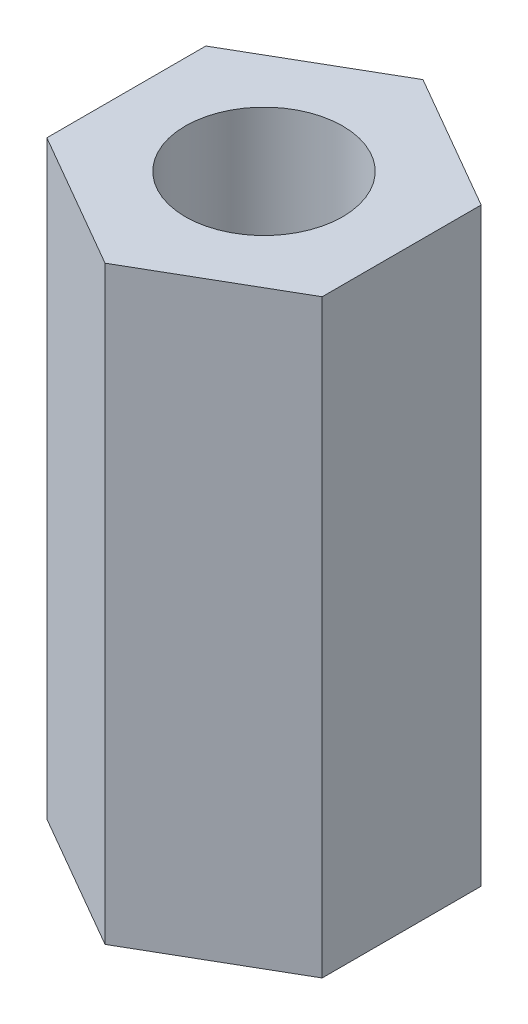
ISO-10303-21;
HEADER;
FILE_DESCRIPTION(('STEP AP214'),'2;1');
FILE_NAME('part.step','',(''),(''),'','','');
FILE_SCHEMA(('AUTOMOTIVE_DESIGN { 1 0 10303 214 1 1 1 1 }'));
ENDSEC;
DATA;
#1=APPLICATION_CONTEXT('core data for automotive mechanical design processes');
#2=APPLICATION_PROTOCOL_DEFINITION('international standard','automotive_design',2000,#1);
#3=PRODUCT_CONTEXT('',#1,'mechanical');
#4=PRODUCT('Part','Part','',(#3));
#5=PRODUCT_RELATED_PRODUCT_CATEGORY('part','',(#4));
#6=PRODUCT_DEFINITION_FORMATION('','',#4);
#7=PRODUCT_DEFINITION_CONTEXT('part definition',#1,'design');
#8=PRODUCT_DEFINITION('design','',#6,#7);
#9=PRODUCT_DEFINITION_SHAPE('','',#8);
#10=(LENGTH_UNIT() NAMED_UNIT(*) SI_UNIT(.MILLI.,.METRE.));
#11=(NAMED_UNIT(*) PLANE_ANGLE_UNIT() SI_UNIT($,.RADIAN.));
#12=(NAMED_UNIT(*) SI_UNIT($,.STERADIAN.) SOLID_ANGLE_UNIT());
#13=UNCERTAINTY_MEASURE_WITH_UNIT(LENGTH_MEASURE(1.E-05),#10,'distance_accuracy_value','');
#14=(GEOMETRIC_REPRESENTATION_CONTEXT(3) GLOBAL_UNCERTAINTY_ASSIGNED_CONTEXT((#13)) GLOBAL_UNIT_ASSIGNED_CONTEXT((#10,
#11,#12)) REPRESENTATION_CONTEXT('',''));
#15=CARTESIAN_POINT('',(0.,0.,0.));
#16=DIRECTION('',(0.,0.,1.));
#17=DIRECTION('',(1.,0.,0.));
#18=AXIS2_PLACEMENT_3D('',#15,#16,#17);
#19=CARTESIAN_POINT('',(0.,15.,0.));
#20=DIRECTION('',(0.,1.,0.));
#21=DIRECTION('',(0.,0.,1.));
#22=AXIS2_PLACEMENT_3D('',#19,#20,#21);
#23=PLANE('',#22);
#24=DIRECTION('',(0.,0.,-1.));
#25=VECTOR('',#24,1.);
#26=CARTESIAN_POINT('',(3.5,15.,2.02072594216369));
#27=LINE('',#26,#25);
#28=CARTESIAN_POINT('',(3.5,15.,2.02072594216369));
#29=VERTEX_POINT('',#28);
#30=CARTESIAN_POINT('',(3.5,15.,-2.02072594216369));
#31=VERTEX_POINT('',#30);
#32=EDGE_CURVE('E139',#29,#31,#27,.T.);
#33=ORIENTED_EDGE('',*,*,#32,.T.);
#34=DIRECTION('',(-0.866025403784439,0.,-0.5));
#35=VECTOR('',#34,1.);
#36=CARTESIAN_POINT('',(3.5,15.,-2.02072594216369));
#37=LINE('',#36,#35);
#38=CARTESIAN_POINT('',(0.,15.,-4.04145188432738));
#39=VERTEX_POINT('',#38);
#40=EDGE_CURVE('E97',#31,#39,#37,.T.);
#41=ORIENTED_EDGE('',*,*,#40,.T.);
#42=DIRECTION('',(-0.866025403784438,0.,0.5));
#43=VECTOR('',#42,1.);
#44=CARTESIAN_POINT('',(0.,15.,-4.04145188432738));
#45=LINE('',#44,#43);
#46=CARTESIAN_POINT('',(-3.5,15.,-2.02072594216369));
#47=VERTEX_POINT('',#46);
#48=EDGE_CURVE('E110',#39,#47,#45,.T.);
#49=ORIENTED_EDGE('',*,*,#48,.T.);
#50=DIRECTION('',(0.,0.,1.));
#51=VECTOR('',#50,1.);
#52=CARTESIAN_POINT('',(-3.5,15.,-2.02072594216369));
#53=LINE('',#52,#51);
#54=CARTESIAN_POINT('',(-3.5,15.,2.02072594216369));
#55=VERTEX_POINT('',#54);
#56=EDGE_CURVE('E104',#47,#55,#53,.T.);
#57=ORIENTED_EDGE('',*,*,#56,.T.);
#58=DIRECTION('',(0.866025403784439,0.,0.5));
#59=VECTOR('',#58,1.);
#60=CARTESIAN_POINT('',(-3.5,15.,2.02072594216369));
#61=LINE('',#60,#59);
#62=CARTESIAN_POINT('',(0.,15.,4.04145188432738));
#63=VERTEX_POINT('',#62);
#64=EDGE_CURVE('E108',#55,#63,#61,.T.);
#65=ORIENTED_EDGE('',*,*,#64,.T.);
#66=DIRECTION('',(0.866025403784439,0.,-0.5));
#67=VECTOR('',#66,1.);
#68=CARTESIAN_POINT('',(0.,15.,4.04145188432738));
#69=LINE('',#68,#67);
#70=EDGE_CURVE('E60',#63,#29,#69,.T.);
#71=ORIENTED_EDGE('',*,*,#70,.T.);
#72=EDGE_LOOP('',(#33,#41,#49,#57,#65,#71));
#73=FACE_BOUND('',#72,.T.);
#74=CARTESIAN_POINT('',(0.,15.,0.));
#75=DIRECTION('',(0.,1.,0.));
#76=DIRECTION('',(0.,0.,1.));
#77=AXIS2_PLACEMENT_3D('',#74,#75,#76);
#78=CIRCLE('',#77,2.);
#79=CARTESIAN_POINT('',(0.,15.,2.));
#80=VERTEX_POINT('',#79);
#81=EDGE_CURVE('E132',#80,#80,#78,.T.);
#82=ORIENTED_EDGE('',*,*,#81,.F.);
#83=EDGE_LOOP('',(#82));
#84=FACE_BOUND('',#83,.T.);
#85=ADVANCED_FACE('F43',(#73,#84),#23,.T.);
#86=CARTESIAN_POINT('',(0.,0.,0.));
#87=DIRECTION('',(0.,1.,0.));
#88=DIRECTION('',(0.,0.,1.));
#89=AXIS2_PLACEMENT_3D('',#86,#87,#88);
#90=PLANE('',#89);
#91=DIRECTION('',(0.,0.,-1.));
#92=VECTOR('',#91,1.);
#93=CARTESIAN_POINT('',(3.5,0.,2.02072594216369));
#94=LINE('',#93,#92);
#95=CARTESIAN_POINT('',(3.5,0.,2.02072594216369));
#96=VERTEX_POINT('',#95);
#97=CARTESIAN_POINT('',(3.5,0.,-2.02072594216369));
#98=VERTEX_POINT('',#97);
#99=EDGE_CURVE('E128',#96,#98,#94,.T.);
#100=ORIENTED_EDGE('',*,*,#99,.F.);
#101=DIRECTION('',(0.866025403784439,0.,-0.5));
#102=VECTOR('',#101,1.);
#103=CARTESIAN_POINT('',(0.,0.,4.04145188432738));
#104=LINE('',#103,#102);
#105=CARTESIAN_POINT('',(0.,0.,4.04145188432738));
#106=VERTEX_POINT('',#105);
#107=EDGE_CURVE('E89',#106,#96,#104,.T.);
#108=ORIENTED_EDGE('',*,*,#107,.F.);
#109=DIRECTION('',(0.866025403784439,0.,0.5));
#110=VECTOR('',#109,1.);
#111=CARTESIAN_POINT('',(-3.5,0.,2.02072594216369));
#112=LINE('',#111,#110);
#113=CARTESIAN_POINT('',(-3.5,0.,2.02072594216369));
#114=VERTEX_POINT('',#113);
#115=EDGE_CURVE('E83',#114,#106,#112,.T.);
#116=ORIENTED_EDGE('',*,*,#115,.F.);
#117=DIRECTION('',(0.,0.,1.));
#118=VECTOR('',#117,1.);
#119=CARTESIAN_POINT('',(-3.5,0.,-2.02072594216369));
#120=LINE('',#119,#118);
#121=CARTESIAN_POINT('',(-3.5,0.,-2.02072594216369));
#122=VERTEX_POINT('',#121);
#123=EDGE_CURVE('E118',#122,#114,#120,.T.);
#124=ORIENTED_EDGE('',*,*,#123,.F.);
#125=DIRECTION('',(-0.866025403784438,0.,0.5));
#126=VECTOR('',#125,1.);
#127=CARTESIAN_POINT('',(0.,0.,-4.04145188432738));
#128=LINE('',#127,#126);
#129=CARTESIAN_POINT('',(0.,0.,-4.04145188432738));
#130=VERTEX_POINT('',#129);
#131=EDGE_CURVE('E134',#130,#122,#128,.T.);
#132=ORIENTED_EDGE('',*,*,#131,.F.);
#133=DIRECTION('',(-0.866025403784439,0.,-0.5));
#134=VECTOR('',#133,1.);
#135=CARTESIAN_POINT('',(3.5,0.,-2.02072594216369));
#136=LINE('',#135,#134);
#137=EDGE_CURVE('E131',#98,#130,#136,.T.);
#138=ORIENTED_EDGE('',*,*,#137,.F.);
#139=EDGE_LOOP('',(#100,#108,#116,#124,#132,#138));
#140=FACE_BOUND('',#139,.T.);
#141=CARTESIAN_POINT('',(0.,0.,0.));
#142=DIRECTION('',(0.,1.,0.));
#143=DIRECTION('',(0.,0.,1.));
#144=AXIS2_PLACEMENT_3D('',#141,#142,#143);
#145=CIRCLE('',#144,2.);
#146=CARTESIAN_POINT('',(0.,0.,2.));
#147=VERTEX_POINT('',#146);
#148=EDGE_CURVE('E232',#147,#147,#145,.T.);
#149=ORIENTED_EDGE('',*,*,#148,.T.);
#150=EDGE_LOOP('',(#149));
#151=FACE_BOUND('',#150,.T.);
#152=ADVANCED_FACE('F148',(#140,#151),#90,.F.);
#153=CARTESIAN_POINT('',(3.5,15.,2.02072594216369));
#154=DIRECTION('',(-1.,0.,0.));
#155=DIRECTION('',(0.,0.,1.));
#156=AXIS2_PLACEMENT_3D('',#153,#154,#155);
#157=PLANE('',#156);
#158=ORIENTED_EDGE('',*,*,#99,.T.);
#159=DIRECTION('',(0.,-1.,0.));
#160=VECTOR('',#159,1.);
#161=CARTESIAN_POINT('',(3.5,15.,-2.02072594216369));
#162=LINE('',#161,#160);
#163=EDGE_CURVE('E11',#31,#98,#162,.T.);
#164=ORIENTED_EDGE('',*,*,#163,.F.);
#165=ORIENTED_EDGE('',*,*,#32,.F.);
#166=DIRECTION('',(0.,-1.,0.));
#167=VECTOR('',#166,1.);
#168=CARTESIAN_POINT('',(3.5,15.,2.02072594216369));
#169=LINE('',#168,#167);
#170=EDGE_CURVE('E124',#29,#96,#169,.T.);
#171=ORIENTED_EDGE('',*,*,#170,.T.);
#172=EDGE_LOOP('',(#158,#164,#165,#171));
#173=FACE_BOUND('',#172,.T.);
#174=ADVANCED_FACE('F45',(#173),#157,.F.);
#175=CARTESIAN_POINT('',(3.5,15.,-2.02072594216369));
#176=DIRECTION('',(-0.5,0.,0.866025403784439));
#177=DIRECTION('',(0.866025403784439,0.,0.5));
#178=AXIS2_PLACEMENT_3D('',#175,#176,#177);
#179=PLANE('',#178);
#180=ORIENTED_EDGE('',*,*,#137,.T.);
#181=DIRECTION('',(0.,-1.,0.));
#182=VECTOR('',#181,1.);
#183=CARTESIAN_POINT('',(0.,15.,-4.04145188432738));
#184=LINE('',#183,#182);
#185=EDGE_CURVE('E52',#39,#130,#184,.T.);
#186=ORIENTED_EDGE('',*,*,#185,.F.);
#187=ORIENTED_EDGE('',*,*,#40,.F.);
#188=ORIENTED_EDGE('',*,*,#163,.T.);
#189=EDGE_LOOP('',(#180,#186,#187,#188));
#190=FACE_BOUND('',#189,.T.);
#191=ADVANCED_FACE('F173',(#190),#179,.F.);
#192=CARTESIAN_POINT('',(0.,15.,-4.04145188432738));
#193=DIRECTION('',(0.5,0.,0.866025403784438));
#194=DIRECTION('',(0.866025403784438,0.,-0.5));
#195=AXIS2_PLACEMENT_3D('',#192,#193,#194);
#196=PLANE('',#195);
#197=ORIENTED_EDGE('',*,*,#131,.T.);
#198=DIRECTION('',(0.,-1.,0.));
#199=VECTOR('',#198,1.);
#200=CARTESIAN_POINT('',(-3.5,15.,-2.02072594216369));
#201=LINE('',#200,#199);
#202=EDGE_CURVE('E119',#47,#122,#201,.T.);
#203=ORIENTED_EDGE('',*,*,#202,.F.);
#204=ORIENTED_EDGE('',*,*,#48,.F.);
#205=ORIENTED_EDGE('',*,*,#185,.T.);
#206=EDGE_LOOP('',(#197,#203,#204,#205));
#207=FACE_BOUND('',#206,.T.);
#208=ADVANCED_FACE('F145',(#207),#196,.F.);
#209=CARTESIAN_POINT('',(-3.5,15.,-2.02072594216369));
#210=DIRECTION('',(1.,0.,0.));
#211=DIRECTION('',(0.,0.,-1.));
#212=AXIS2_PLACEMENT_3D('',#209,#210,#211);
#213=PLANE('',#212);
#214=ORIENTED_EDGE('',*,*,#123,.T.);
#215=DIRECTION('',(0.,-1.,0.));
#216=VECTOR('',#215,1.);
#217=CARTESIAN_POINT('',(-3.5,15.,2.02072594216369));
#218=LINE('',#217,#216);
#219=EDGE_CURVE('E115',#55,#114,#218,.T.);
#220=ORIENTED_EDGE('',*,*,#219,.F.);
#221=ORIENTED_EDGE('',*,*,#56,.F.);
#222=ORIENTED_EDGE('',*,*,#202,.T.);
#223=EDGE_LOOP('',(#214,#220,#221,#222));
#224=FACE_BOUND('',#223,.T.);
#225=ADVANCED_FACE('F116',(#224),#213,.F.);
#226=CARTESIAN_POINT('',(-3.5,15.,2.02072594216369));
#227=DIRECTION('',(0.5,0.,-0.866025403784439));
#228=DIRECTION('',(-0.866025403784439,0.,-0.5));
#229=AXIS2_PLACEMENT_3D('',#226,#227,#228);
#230=PLANE('',#229);
#231=ORIENTED_EDGE('',*,*,#115,.T.);
#232=DIRECTION('',(0.,-1.,0.));
#233=VECTOR('',#232,1.);
#234=CARTESIAN_POINT('',(0.,15.,4.04145188432738));
#235=LINE('',#234,#233);
#236=EDGE_CURVE('E120',#63,#106,#235,.T.);
#237=ORIENTED_EDGE('',*,*,#236,.F.);
#238=ORIENTED_EDGE('',*,*,#64,.F.);
#239=ORIENTED_EDGE('',*,*,#219,.T.);
#240=EDGE_LOOP('',(#231,#237,#238,#239));
#241=FACE_BOUND('',#240,.T.);
#242=ADVANCED_FACE('F122',(#241),#230,.F.);
#243=CARTESIAN_POINT('',(0.,15.,4.04145188432738));
#244=DIRECTION('',(-0.5,0.,-0.866025403784438));
#245=DIRECTION('',(-0.866025403784439,0.,0.5));
#246=AXIS2_PLACEMENT_3D('',#243,#244,#245);
#247=PLANE('',#246);
#248=ORIENTED_EDGE('',*,*,#107,.T.);
#249=ORIENTED_EDGE('',*,*,#170,.F.);
#250=ORIENTED_EDGE('',*,*,#70,.F.);
#251=ORIENTED_EDGE('',*,*,#236,.T.);
#252=EDGE_LOOP('',(#248,#249,#250,#251));
#253=FACE_BOUND('',#252,.T.);
#254=ADVANCED_FACE('F153',(#253),#247,.F.);
#255=CARTESIAN_POINT('',(0.,15.,0.));
#256=DIRECTION('',(0.,-1.,0.));
#257=DIRECTION('',(0.,0.,-1.));
#258=AXIS2_PLACEMENT_3D('',#255,#256,#257);
#259=CYLINDRICAL_SURFACE('',#258,2.);
#260=ORIENTED_EDGE('',*,*,#81,.T.);
#261=EDGE_LOOP('',(#260));
#262=FACE_BOUND('',#261,.T.);
#263=ORIENTED_EDGE('',*,*,#148,.F.);
#264=EDGE_LOOP('',(#263));
#265=FACE_BOUND('',#264,.T.);
#266=ADVANCED_FACE('F155',(#262,#265),#259,.F.);
#267=CLOSED_SHELL('',(#85,#152,#174,#191,#208,#225,#242,#254,#266));
#268=MANIFOLD_SOLID_BREP('B2',#267);
#269=ADVANCED_BREP_SHAPE_REPRESENTATION('',(#18,#268),#14);
#270=SHAPE_DEFINITION_REPRESENTATION(#9,#269);
ENDSEC;
END-ISO-10303-21;
